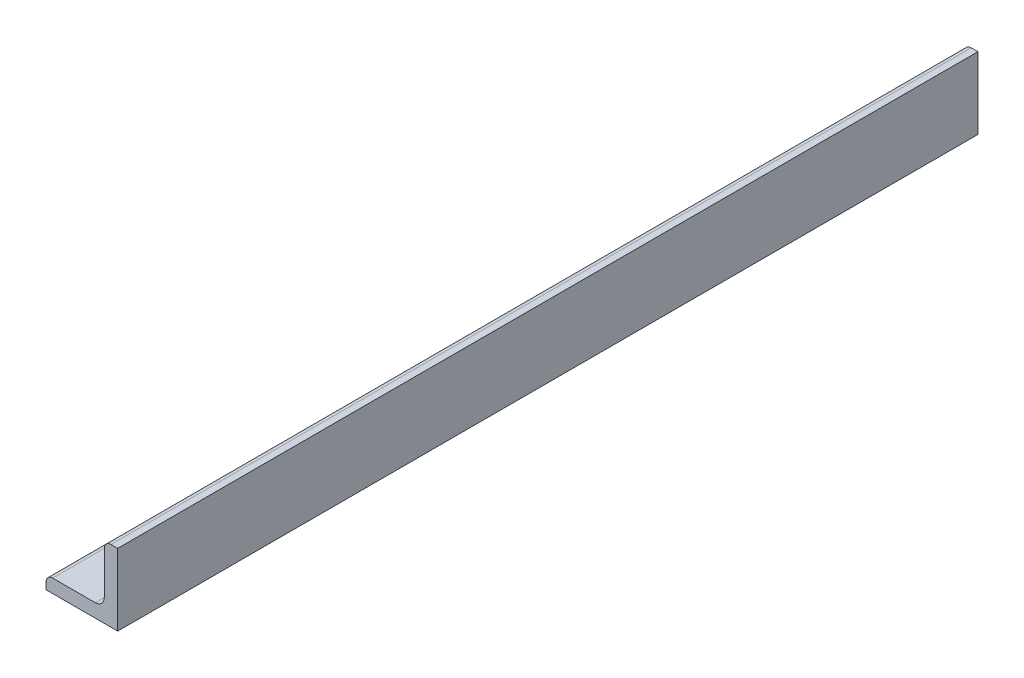
ISO-10303-21;
HEADER;
FILE_DESCRIPTION(('STEP AP214'),'2;1');
FILE_NAME('part.step','',(''),(''),'','','');
FILE_SCHEMA(('AUTOMOTIVE_DESIGN { 1 0 10303 214 1 1 1 1 }'));
ENDSEC;
DATA;
#1=APPLICATION_CONTEXT('core data for automotive mechanical design processes');
#2=APPLICATION_PROTOCOL_DEFINITION('international standard','automotive_design',2000,#1);
#3=PRODUCT_CONTEXT('',#1,'mechanical');
#4=PRODUCT('Part','Part','',(#3));
#5=PRODUCT_RELATED_PRODUCT_CATEGORY('part','',(#4));
#6=PRODUCT_DEFINITION_FORMATION('','',#4);
#7=PRODUCT_DEFINITION_CONTEXT('part definition',#1,'design');
#8=PRODUCT_DEFINITION('design','',#6,#7);
#9=PRODUCT_DEFINITION_SHAPE('','',#8);
#10=(LENGTH_UNIT() NAMED_UNIT(*) SI_UNIT(.MILLI.,.METRE.));
#11=(NAMED_UNIT(*) PLANE_ANGLE_UNIT() SI_UNIT($,.RADIAN.));
#12=(NAMED_UNIT(*) SI_UNIT($,.STERADIAN.) SOLID_ANGLE_UNIT());
#13=UNCERTAINTY_MEASURE_WITH_UNIT(LENGTH_MEASURE(1.E-05),#10,'distance_accuracy_value','');
#14=(GEOMETRIC_REPRESENTATION_CONTEXT(3) GLOBAL_UNCERTAINTY_ASSIGNED_CONTEXT((#13)) GLOBAL_UNIT_ASSIGNED_CONTEXT((#10,
#11,#12)) REPRESENTATION_CONTEXT('',''));
#15=CARTESIAN_POINT('',(0.,0.,0.));
#16=DIRECTION('',(0.,0.,1.));
#17=DIRECTION('',(1.,0.,0.));
#18=AXIS2_PLACEMENT_3D('',#15,#16,#17);
#19=CARTESIAN_POINT('',(-12.7,2.38125,152.4));
#20=DIRECTION('',(1.,0.,0.));
#21=DIRECTION('',(0.,0.,-1.));
#22=AXIS2_PLACEMENT_3D('',#19,#20,#21);
#23=PLANE('',#22);
#24=DIRECTION('',(0.,-1.,0.));
#25=VECTOR('',#24,1.);
#26=CARTESIAN_POINT('',(-12.7,2.38125,-152.4));
#27=LINE('',#26,#25);
#28=CARTESIAN_POINT('',(-12.7,2.38125,-152.4));
#29=VERTEX_POINT('',#28);
#30=CARTESIAN_POINT('',(-12.7,0.,-152.4));
#31=VERTEX_POINT('',#30);
#32=EDGE_CURVE('E134',#29,#31,#27,.T.);
#33=ORIENTED_EDGE('',*,*,#32,.T.);
#34=DIRECTION('',(0.,0.,-1.));
#35=VECTOR('',#34,1.);
#36=CARTESIAN_POINT('',(-12.7,0.,152.4));
#37=LINE('',#36,#35);
#38=CARTESIAN_POINT('',(-12.7,0.,152.4));
#39=VERTEX_POINT('',#38);
#40=EDGE_CURVE('E11',#39,#31,#37,.T.);
#41=ORIENTED_EDGE('',*,*,#40,.F.);
#42=DIRECTION('',(0.,-1.,0.));
#43=VECTOR('',#42,1.);
#44=CARTESIAN_POINT('',(-12.7,2.38125,152.4));
#45=LINE('',#44,#43);
#46=CARTESIAN_POINT('',(-12.7,2.38125,152.4));
#47=VERTEX_POINT('',#46);
#48=EDGE_CURVE('E150',#47,#39,#45,.T.);
#49=ORIENTED_EDGE('',*,*,#48,.F.);
#50=DIRECTION('',(0.,0.,-1.));
#51=VECTOR('',#50,1.);
#52=CARTESIAN_POINT('',(-12.7,2.38125,152.4));
#53=LINE('',#52,#51);
#54=EDGE_CURVE('E130',#47,#29,#53,.T.);
#55=ORIENTED_EDGE('',*,*,#54,.T.);
#56=EDGE_LOOP('',(#33,#41,#49,#55));
#57=FACE_BOUND('',#56,.T.);
#58=ADVANCED_FACE('F32',(#57),#23,.F.);
#59=CARTESIAN_POINT('',(-12.7,0.,152.4));
#60=DIRECTION('',(0.,1.,0.));
#61=DIRECTION('',(0.,0.,1.));
#62=AXIS2_PLACEMENT_3D('',#59,#60,#61);
#63=PLANE('',#62);
#64=DIRECTION('',(1.,0.,0.));
#65=VECTOR('',#64,1.);
#66=CARTESIAN_POINT('',(-12.7,0.,-152.4));
#67=LINE('',#66,#65);
#68=CARTESIAN_POINT('',(12.7,0.,-152.4));
#69=VERTEX_POINT('',#68);
#70=EDGE_CURVE('E137',#31,#69,#67,.T.);
#71=ORIENTED_EDGE('',*,*,#70,.T.);
#72=DIRECTION('',(0.,0.,-1.));
#73=VECTOR('',#72,1.);
#74=CARTESIAN_POINT('',(12.7,0.,152.4));
#75=LINE('',#74,#73);
#76=CARTESIAN_POINT('',(12.7,0.,152.4));
#77=VERTEX_POINT('',#76);
#78=EDGE_CURVE('E40',#77,#69,#75,.T.);
#79=ORIENTED_EDGE('',*,*,#78,.F.);
#80=DIRECTION('',(1.,0.,0.));
#81=VECTOR('',#80,1.);
#82=CARTESIAN_POINT('',(-12.7,0.,152.4));
#83=LINE('',#82,#81);
#84=EDGE_CURVE('E94',#39,#77,#83,.T.);
#85=ORIENTED_EDGE('',*,*,#84,.F.);
#86=ORIENTED_EDGE('',*,*,#40,.T.);
#87=EDGE_LOOP('',(#71,#79,#85,#86));
#88=FACE_BOUND('',#87,.T.);
#89=ADVANCED_FACE('F193',(#88),#63,.F.);
#90=CARTESIAN_POINT('',(12.7,0.,152.4));
#91=DIRECTION('',(-1.,0.,0.));
#92=DIRECTION('',(0.,0.,1.));
#93=AXIS2_PLACEMENT_3D('',#90,#91,#92);
#94=PLANE('',#93);
#95=DIRECTION('',(0.,1.,0.));
#96=VECTOR('',#95,1.);
#97=CARTESIAN_POINT('',(12.7,0.,-152.4));
#98=LINE('',#97,#96);
#99=CARTESIAN_POINT('',(12.7,25.4,-152.4));
#100=VERTEX_POINT('',#99);
#101=EDGE_CURVE('E139',#69,#100,#98,.T.);
#102=ORIENTED_EDGE('',*,*,#101,.T.);
#103=DIRECTION('',(0.,0.,-1.));
#104=VECTOR('',#103,1.);
#105=CARTESIAN_POINT('',(12.7,25.4,152.4));
#106=LINE('',#105,#104);
#107=CARTESIAN_POINT('',(12.7,25.4,152.4));
#108=VERTEX_POINT('',#107);
#109=EDGE_CURVE('E160',#108,#100,#106,.T.);
#110=ORIENTED_EDGE('',*,*,#109,.F.);
#111=DIRECTION('',(0.,1.,0.));
#112=VECTOR('',#111,1.);
#113=CARTESIAN_POINT('',(12.7,0.,152.4));
#114=LINE('',#113,#112);
#115=EDGE_CURVE('E168',#77,#108,#114,.T.);
#116=ORIENTED_EDGE('',*,*,#115,.F.);
#117=ORIENTED_EDGE('',*,*,#78,.T.);
#118=EDGE_LOOP('',(#102,#110,#116,#117));
#119=FACE_BOUND('',#118,.T.);
#120=ADVANCED_FACE('F166',(#119),#94,.F.);
#121=CARTESIAN_POINT('',(10.31875,25.4,152.4));
#122=DIRECTION('',(0.,-1.,0.));
#123=DIRECTION('',(0.,0.,-1.));
#124=AXIS2_PLACEMENT_3D('',#121,#122,#123);
#125=PLANE('',#124);
#126=DIRECTION('',(-1.,0.,0.));
#127=VECTOR('',#126,1.);
#128=CARTESIAN_POINT('',(10.31875,25.4,-152.4));
#129=LINE('',#128,#127);
#130=CARTESIAN_POINT('',(10.31875,25.4,-152.4));
#131=VERTEX_POINT('',#130);
#132=EDGE_CURVE('E141',#100,#131,#129,.T.);
#133=ORIENTED_EDGE('',*,*,#132,.T.);
#134=DIRECTION('',(0.,0.,-1.));
#135=VECTOR('',#134,1.);
#136=CARTESIAN_POINT('',(10.31875,25.4,152.4));
#137=LINE('',#136,#135);
#138=CARTESIAN_POINT('',(10.31875,25.4,152.4));
#139=VERTEX_POINT('',#138);
#140=EDGE_CURVE('E157',#139,#131,#137,.T.);
#141=ORIENTED_EDGE('',*,*,#140,.F.);
#142=DIRECTION('',(-1.,0.,0.));
#143=VECTOR('',#142,1.);
#144=CARTESIAN_POINT('',(10.31875,25.4,152.4));
#145=LINE('',#144,#143);
#146=EDGE_CURVE('E184',#108,#139,#145,.T.);
#147=ORIENTED_EDGE('',*,*,#146,.F.);
#148=ORIENTED_EDGE('',*,*,#109,.T.);
#149=EDGE_LOOP('',(#133,#141,#147,#148));
#150=FACE_BOUND('',#149,.T.);
#151=ADVANCED_FACE('F177',(#150),#125,.F.);
#152=CARTESIAN_POINT('',(10.31875,23.01875,152.4));
#153=DIRECTION('',(0.,0.,-1.));
#154=DIRECTION('',(-1.,0.,0.));
#155=AXIS2_PLACEMENT_3D('',#152,#153,#154);
#156=CYLINDRICAL_SURFACE('',#155,2.38125);
#157=CARTESIAN_POINT('',(10.31875,23.01875,-152.4));
#158=DIRECTION('',(0.,0.,1.));
#159=DIRECTION('',(-1.,0.,0.));
#160=AXIS2_PLACEMENT_3D('',#157,#158,#159);
#161=CIRCLE('',#160,2.38125);
#162=CARTESIAN_POINT('',(7.9375,23.01875,-152.4));
#163=VERTEX_POINT('',#162);
#164=EDGE_CURVE('E143',#131,#163,#161,.T.);
#165=ORIENTED_EDGE('',*,*,#164,.T.);
#166=DIRECTION('',(0.,0.,-1.));
#167=VECTOR('',#166,1.);
#168=CARTESIAN_POINT('',(7.9375,23.01875,152.4));
#169=LINE('',#168,#167);
#170=CARTESIAN_POINT('',(7.9375,23.01875,152.4));
#171=VERTEX_POINT('',#170);
#172=EDGE_CURVE('E154',#171,#163,#169,.T.);
#173=ORIENTED_EDGE('',*,*,#172,.F.);
#174=CARTESIAN_POINT('',(10.31875,23.01875,152.4));
#175=DIRECTION('',(0.,0.,1.));
#176=DIRECTION('',(-1.,0.,0.));
#177=AXIS2_PLACEMENT_3D('',#174,#175,#176);
#178=CIRCLE('',#177,2.38125);
#179=EDGE_CURVE('E183',#139,#171,#178,.T.);
#180=ORIENTED_EDGE('',*,*,#179,.F.);
#181=ORIENTED_EDGE('',*,*,#140,.T.);
#182=EDGE_LOOP('',(#165,#173,#180,#181));
#183=FACE_BOUND('',#182,.T.);
#184=ADVANCED_FACE('F181',(#183),#156,.T.);
#185=CARTESIAN_POINT('',(7.9375,23.01875,152.4));
#186=DIRECTION('',(1.,0.,0.));
#187=DIRECTION('',(0.,0.,-1.));
#188=AXIS2_PLACEMENT_3D('',#185,#186,#187);
#189=PLANE('',#188);
#190=DIRECTION('',(0.,-1.,0.));
#191=VECTOR('',#190,1.);
#192=CARTESIAN_POINT('',(7.9375,23.01875,-152.4));
#193=LINE('',#192,#191);
#194=CARTESIAN_POINT('',(7.9375,7.9375,-152.4));
#195=VERTEX_POINT('',#194);
#196=EDGE_CURVE('E145',#163,#195,#193,.T.);
#197=ORIENTED_EDGE('',*,*,#196,.T.);
#198=DIRECTION('',(0.,0.,-1.));
#199=VECTOR('',#198,1.);
#200=CARTESIAN_POINT('',(7.9375,7.9375,152.4));
#201=LINE('',#200,#199);
#202=CARTESIAN_POINT('',(7.9375,7.9375,152.4));
#203=VERTEX_POINT('',#202);
#204=EDGE_CURVE('E125',#203,#195,#201,.T.);
#205=ORIENTED_EDGE('',*,*,#204,.F.);
#206=DIRECTION('',(0.,-1.,0.));
#207=VECTOR('',#206,1.);
#208=CARTESIAN_POINT('',(7.9375,23.01875,152.4));
#209=LINE('',#208,#207);
#210=EDGE_CURVE('E116',#171,#203,#209,.T.);
#211=ORIENTED_EDGE('',*,*,#210,.F.);
#212=ORIENTED_EDGE('',*,*,#172,.T.);
#213=EDGE_LOOP('',(#197,#205,#211,#212));
#214=FACE_BOUND('',#213,.T.);
#215=ADVANCED_FACE('F205',(#214),#189,.F.);
#216=CARTESIAN_POINT('',(4.7625,7.9375,152.4));
#217=DIRECTION('',(0.,0.,-1.));
#218=DIRECTION('',(-1.,0.,0.));
#219=AXIS2_PLACEMENT_3D('',#216,#217,#218);
#220=CYLINDRICAL_SURFACE('',#219,3.175);
#221=CARTESIAN_POINT('',(4.7625,7.9375,-152.4));
#222=DIRECTION('',(0.,0.,-1.));
#223=DIRECTION('',(-1.,0.,0.));
#224=AXIS2_PLACEMENT_3D('',#221,#222,#223);
#225=CIRCLE('',#224,3.175);
#226=CARTESIAN_POINT('',(4.7625,4.7625,-152.4));
#227=VERTEX_POINT('',#226);
#228=EDGE_CURVE('E124',#195,#227,#225,.T.);
#229=ORIENTED_EDGE('',*,*,#228,.T.);
#230=DIRECTION('',(0.,0.,-1.));
#231=VECTOR('',#230,1.);
#232=CARTESIAN_POINT('',(4.7625,4.7625,152.4));
#233=LINE('',#232,#231);
#234=CARTESIAN_POINT('',(4.7625,4.7625,152.4));
#235=VERTEX_POINT('',#234);
#236=EDGE_CURVE('E121',#235,#227,#233,.T.);
#237=ORIENTED_EDGE('',*,*,#236,.F.);
#238=CARTESIAN_POINT('',(4.7625,7.9375,152.4));
#239=DIRECTION('',(0.,0.,-1.));
#240=DIRECTION('',(-1.,0.,0.));
#241=AXIS2_PLACEMENT_3D('',#238,#239,#240);
#242=CIRCLE('',#241,3.175);
#243=EDGE_CURVE('E110',#203,#235,#242,.T.);
#244=ORIENTED_EDGE('',*,*,#243,.F.);
#245=ORIENTED_EDGE('',*,*,#204,.T.);
#246=EDGE_LOOP('',(#229,#237,#244,#245));
#247=FACE_BOUND('',#246,.T.);
#248=ADVANCED_FACE('F122',(#247),#220,.F.);
#249=CARTESIAN_POINT('',(4.7625,4.7625,152.4));
#250=DIRECTION('',(0.,-1.,0.));
#251=DIRECTION('',(1.,0.,0.));
#252=AXIS2_PLACEMENT_3D('',#249,#250,#251);
#253=PLANE('',#252);
#254=DIRECTION('',(-1.,0.,0.));
#255=VECTOR('',#254,1.);
#256=CARTESIAN_POINT('',(4.7625,4.7625,-152.4));
#257=LINE('',#256,#255);
#258=CARTESIAN_POINT('',(-10.31875,4.7625,-152.4));
#259=VERTEX_POINT('',#258);
#260=EDGE_CURVE('E80',#227,#259,#257,.T.);
#261=ORIENTED_EDGE('',*,*,#260,.T.);
#262=DIRECTION('',(0.,0.,-1.));
#263=VECTOR('',#262,1.);
#264=CARTESIAN_POINT('',(-10.31875,4.7625,152.4));
#265=LINE('',#264,#263);
#266=CARTESIAN_POINT('',(-10.31875,4.7625,152.4));
#267=VERTEX_POINT('',#266);
#268=EDGE_CURVE('E126',#267,#259,#265,.T.);
#269=ORIENTED_EDGE('',*,*,#268,.F.);
#270=DIRECTION('',(-1.,0.,0.));
#271=VECTOR('',#270,1.);
#272=CARTESIAN_POINT('',(4.7625,4.7625,152.4));
#273=LINE('',#272,#271);
#274=EDGE_CURVE('E114',#235,#267,#273,.T.);
#275=ORIENTED_EDGE('',*,*,#274,.F.);
#276=ORIENTED_EDGE('',*,*,#236,.T.);
#277=EDGE_LOOP('',(#261,#269,#275,#276));
#278=FACE_BOUND('',#277,.T.);
#279=ADVANCED_FACE('F128',(#278),#253,.F.);
#280=CARTESIAN_POINT('',(-10.31875,2.38125,152.4));
#281=DIRECTION('',(0.,0.,-1.));
#282=DIRECTION('',(-1.,0.,0.));
#283=AXIS2_PLACEMENT_3D('',#280,#281,#282);
#284=CYLINDRICAL_SURFACE('',#283,2.38125);
#285=CARTESIAN_POINT('',(-10.31875,2.38125,-152.4));
#286=DIRECTION('',(0.,0.,1.));
#287=DIRECTION('',(-1.,0.,0.));
#288=AXIS2_PLACEMENT_3D('',#285,#286,#287);
#289=CIRCLE('',#288,2.38125);
#290=EDGE_CURVE('E86',#259,#29,#289,.T.);
#291=ORIENTED_EDGE('',*,*,#290,.T.);
#292=ORIENTED_EDGE('',*,*,#54,.F.);
#293=CARTESIAN_POINT('',(-10.31875,2.38125,152.4));
#294=DIRECTION('',(0.,0.,1.));
#295=DIRECTION('',(-1.,0.,0.));
#296=AXIS2_PLACEMENT_3D('',#293,#294,#295);
#297=CIRCLE('',#296,2.38125);
#298=EDGE_CURVE('E48',#267,#47,#297,.T.);
#299=ORIENTED_EDGE('',*,*,#298,.F.);
#300=ORIENTED_EDGE('',*,*,#268,.T.);
#301=EDGE_LOOP('',(#291,#292,#299,#300));
#302=FACE_BOUND('',#301,.T.);
#303=ADVANCED_FACE('F213',(#302),#284,.T.);
#304=CARTESIAN_POINT('',(10.31875,23.01875,152.4));
#305=DIRECTION('',(0.,0.,-1.));
#306=DIRECTION('',(-1.,0.,0.));
#307=AXIS2_PLACEMENT_3D('',#304,#305,#306);
#308=PLANE('',#307);
#309=ORIENTED_EDGE('',*,*,#48,.T.);
#310=ORIENTED_EDGE('',*,*,#84,.T.);
#311=ORIENTED_EDGE('',*,*,#115,.T.);
#312=ORIENTED_EDGE('',*,*,#146,.T.);
#313=ORIENTED_EDGE('',*,*,#179,.T.);
#314=ORIENTED_EDGE('',*,*,#210,.T.);
#315=ORIENTED_EDGE('',*,*,#243,.T.);
#316=ORIENTED_EDGE('',*,*,#274,.T.);
#317=ORIENTED_EDGE('',*,*,#298,.T.);
#318=EDGE_LOOP('',(#309,#310,#311,#312,#313,#314,#315,#316,#317));
#319=FACE_BOUND('',#318,.T.);
#320=ADVANCED_FACE('F112',(#319),#308,.F.);
#321=CARTESIAN_POINT('',(10.31875,23.01875,-152.4));
#322=DIRECTION('',(0.,0.,-1.));
#323=DIRECTION('',(-1.,0.,0.));
#324=AXIS2_PLACEMENT_3D('',#321,#322,#323);
#325=PLANE('',#324);
#326=ORIENTED_EDGE('',*,*,#32,.F.);
#327=ORIENTED_EDGE('',*,*,#290,.F.);
#328=ORIENTED_EDGE('',*,*,#260,.F.);
#329=ORIENTED_EDGE('',*,*,#228,.F.);
#330=ORIENTED_EDGE('',*,*,#196,.F.);
#331=ORIENTED_EDGE('',*,*,#164,.F.);
#332=ORIENTED_EDGE('',*,*,#132,.F.);
#333=ORIENTED_EDGE('',*,*,#101,.F.);
#334=ORIENTED_EDGE('',*,*,#70,.F.);
#335=EDGE_LOOP('',(#326,#327,#328,#329,#330,#331,#332,#333,#334));
#336=FACE_BOUND('',#335,.T.);
#337=ADVANCED_FACE('F172',(#336),#325,.T.);
#338=CLOSED_SHELL('',(#58,#89,#120,#151,#184,#215,#248,#279,#303,#320,#337));
#339=MANIFOLD_SOLID_BREP('B2',#338);
#340=ADVANCED_BREP_SHAPE_REPRESENTATION('',(#18,#339),#14);
#341=SHAPE_DEFINITION_REPRESENTATION(#9,#340);
ENDSEC;
END-ISO-10303-21;
